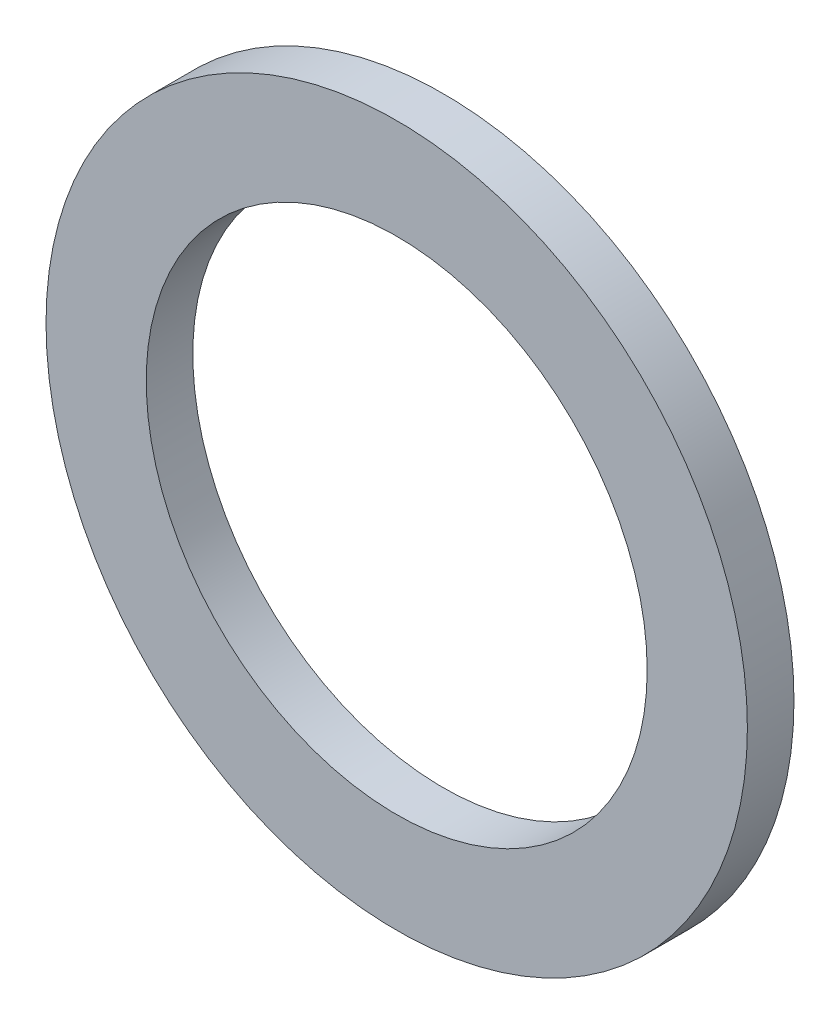
ISO-10303-21;
HEADER;
FILE_DESCRIPTION(('STEP AP214'),'2;1');
FILE_NAME('part.step','',(''),(''),'','','');
FILE_SCHEMA(('AUTOMOTIVE_DESIGN { 1 0 10303 214 1 1 1 1 }'));
ENDSEC;
DATA;
#1=APPLICATION_CONTEXT('core data for automotive mechanical design processes');
#2=APPLICATION_PROTOCOL_DEFINITION('international standard','automotive_design',2000,#1);
#3=PRODUCT_CONTEXT('',#1,'mechanical');
#4=PRODUCT('Part','Part','',(#3));
#5=PRODUCT_RELATED_PRODUCT_CATEGORY('part','',(#4));
#6=PRODUCT_DEFINITION_FORMATION('','',#4);
#7=PRODUCT_DEFINITION_CONTEXT('part definition',#1,'design');
#8=PRODUCT_DEFINITION('design','',#6,#7);
#9=PRODUCT_DEFINITION_SHAPE('','',#8);
#10=(LENGTH_UNIT() NAMED_UNIT(*) SI_UNIT(.MILLI.,.METRE.));
#11=(NAMED_UNIT(*) PLANE_ANGLE_UNIT() SI_UNIT($,.RADIAN.));
#12=(NAMED_UNIT(*) SI_UNIT($,.STERADIAN.) SOLID_ANGLE_UNIT());
#13=UNCERTAINTY_MEASURE_WITH_UNIT(LENGTH_MEASURE(1.E-05),#10,'distance_accuracy_value','');
#14=(GEOMETRIC_REPRESENTATION_CONTEXT(3) GLOBAL_UNCERTAINTY_ASSIGNED_CONTEXT((#13)) GLOBAL_UNIT_ASSIGNED_CONTEXT((#10,
#11,#12)) REPRESENTATION_CONTEXT('',''));
#15=CARTESIAN_POINT('',(0.,0.,0.));
#16=DIRECTION('',(0.,0.,1.));
#17=DIRECTION('',(1.,0.,0.));
#18=AXIS2_PLACEMENT_3D('',#15,#16,#17);
#19=CARTESIAN_POINT('',(0.,0.,0.93));
#20=DIRECTION('',(0.,0.,1.));
#21=DIRECTION('',(1.,0.,0.));
#22=AXIS2_PLACEMENT_3D('',#19,#20,#21);
#23=PLANE('',#22);
#24=CARTESIAN_POINT('',(0.,0.,0.93));
#25=DIRECTION('',(0.,0.,1.));
#26=DIRECTION('',(1.,0.,0.));
#27=AXIS2_PLACEMENT_3D('',#24,#25,#26);
#28=CIRCLE('',#27,7.);
#29=CARTESIAN_POINT('',(7.,0.,0.93));
#30=VERTEX_POINT('',#29);
#31=EDGE_CURVE('E10',#30,#30,#28,.T.);
#32=ORIENTED_EDGE('',*,*,#31,.T.);
#33=EDGE_LOOP('',(#32));
#34=FACE_BOUND('',#33,.T.);
#35=CARTESIAN_POINT('',(0.,0.,0.93));
#36=DIRECTION('',(0.,0.,1.));
#37=DIRECTION('',(1.,0.,0.));
#38=AXIS2_PLACEMENT_3D('',#35,#36,#37);
#39=CIRCLE('',#38,5.);
#40=CARTESIAN_POINT('',(5.,0.,0.93));
#41=VERTEX_POINT('',#40);
#42=EDGE_CURVE('E42',#41,#41,#39,.T.);
#43=ORIENTED_EDGE('',*,*,#42,.F.);
#44=EDGE_LOOP('',(#43));
#45=FACE_BOUND('',#44,.T.);
#46=ADVANCED_FACE('F31',(#34,#45),#23,.T.);
#47=CARTESIAN_POINT('',(0.,0.,0.));
#48=DIRECTION('',(0.,0.,1.));
#49=DIRECTION('',(1.,0.,0.));
#50=AXIS2_PLACEMENT_3D('',#47,#48,#49);
#51=PLANE('',#50);
#52=CARTESIAN_POINT('',(0.,0.,0.));
#53=DIRECTION('',(0.,0.,1.));
#54=DIRECTION('',(1.,0.,0.));
#55=AXIS2_PLACEMENT_3D('',#52,#53,#54);
#56=CIRCLE('',#55,7.);
#57=CARTESIAN_POINT('',(7.,0.,0.));
#58=VERTEX_POINT('',#57);
#59=EDGE_CURVE('E35',#58,#58,#56,.T.);
#60=ORIENTED_EDGE('',*,*,#59,.F.);
#61=EDGE_LOOP('',(#60));
#62=FACE_BOUND('',#61,.T.);
#63=CARTESIAN_POINT('',(0.,0.,0.));
#64=DIRECTION('',(0.,0.,1.));
#65=DIRECTION('',(1.,0.,0.));
#66=AXIS2_PLACEMENT_3D('',#63,#64,#65);
#67=CIRCLE('',#66,5.);
#68=CARTESIAN_POINT('',(5.,0.,0.));
#69=VERTEX_POINT('',#68);
#70=EDGE_CURVE('E44',#69,#69,#67,.T.);
#71=ORIENTED_EDGE('',*,*,#70,.T.);
#72=EDGE_LOOP('',(#71));
#73=FACE_BOUND('',#72,.T.);
#74=ADVANCED_FACE('F54',(#62,#73),#51,.F.);
#75=CARTESIAN_POINT('',(0.,0.,0.93));
#76=DIRECTION('',(0.,0.,-1.));
#77=DIRECTION('',(-1.,0.,0.));
#78=AXIS2_PLACEMENT_3D('',#75,#76,#77);
#79=CYLINDRICAL_SURFACE('',#78,7.);
#80=ORIENTED_EDGE('',*,*,#31,.F.);
#81=EDGE_LOOP('',(#80));
#82=FACE_BOUND('',#81,.T.);
#83=ORIENTED_EDGE('',*,*,#59,.T.);
#84=EDGE_LOOP('',(#83));
#85=FACE_BOUND('',#84,.T.);
#86=ADVANCED_FACE('F33',(#82,#85),#79,.T.);
#87=CARTESIAN_POINT('',(0.,0.,0.93));
#88=DIRECTION('',(0.,0.,-1.));
#89=DIRECTION('',(-1.,0.,0.));
#90=AXIS2_PLACEMENT_3D('',#87,#88,#89);
#91=CYLINDRICAL_SURFACE('',#90,5.);
#92=ORIENTED_EDGE('',*,*,#42,.T.);
#93=EDGE_LOOP('',(#92));
#94=FACE_BOUND('',#93,.T.);
#95=ORIENTED_EDGE('',*,*,#70,.F.);
#96=EDGE_LOOP('',(#95));
#97=FACE_BOUND('',#96,.T.);
#98=ADVANCED_FACE('F50',(#94,#97),#91,.F.);
#99=CLOSED_SHELL('',(#46,#74,#86,#98));
#100=MANIFOLD_SOLID_BREP('B2',#99);
#101=ADVANCED_BREP_SHAPE_REPRESENTATION('',(#18,#100),#14);
#102=SHAPE_DEFINITION_REPRESENTATION(#9,#101);
ENDSEC;
END-ISO-10303-21;
